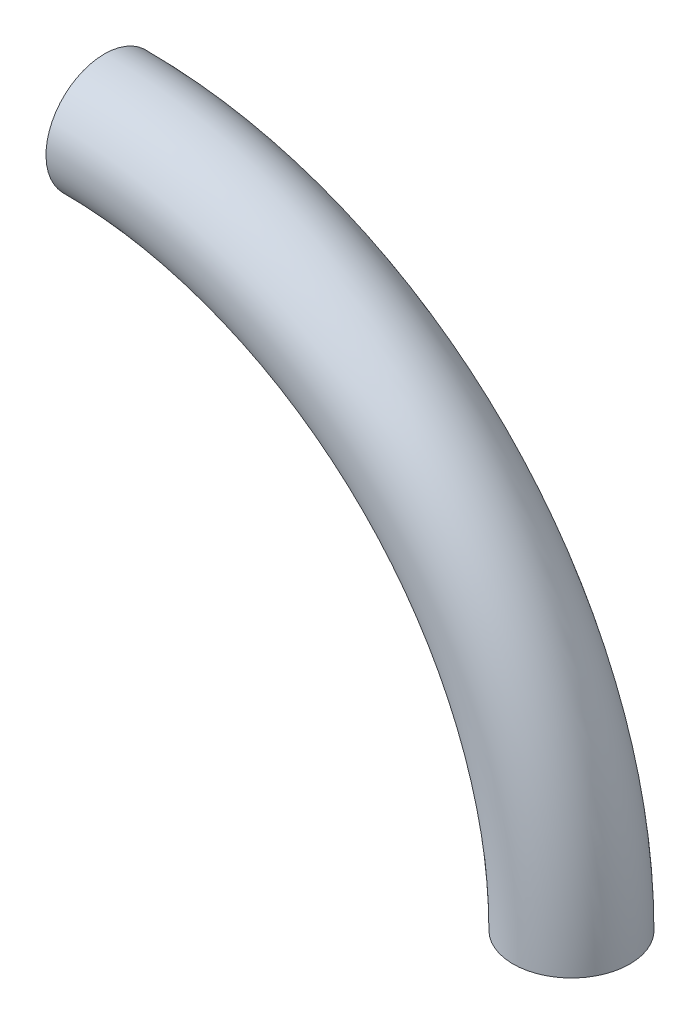
ISO-10303-21;
HEADER;
FILE_DESCRIPTION(('STEP AP214'),'2;1');
FILE_NAME('part.step','',(''),(''),'','','');
FILE_SCHEMA(('AUTOMOTIVE_DESIGN { 1 0 10303 214 1 1 1 1 }'));
ENDSEC;
DATA;
#1=APPLICATION_CONTEXT('core data for automotive mechanical design processes');
#2=APPLICATION_PROTOCOL_DEFINITION('international standard','automotive_design',2000,#1);
#3=PRODUCT_CONTEXT('',#1,'mechanical');
#4=PRODUCT('Part','Part','',(#3));
#5=PRODUCT_RELATED_PRODUCT_CATEGORY('part','',(#4));
#6=PRODUCT_DEFINITION_FORMATION('','',#4);
#7=PRODUCT_DEFINITION_CONTEXT('part definition',#1,'design');
#8=PRODUCT_DEFINITION('design','',#6,#7);
#9=PRODUCT_DEFINITION_SHAPE('','',#8);
#10=(LENGTH_UNIT() NAMED_UNIT(*) SI_UNIT(.MILLI.,.METRE.));
#11=(NAMED_UNIT(*) PLANE_ANGLE_UNIT() SI_UNIT($,.RADIAN.));
#12=(NAMED_UNIT(*) SI_UNIT($,.STERADIAN.) SOLID_ANGLE_UNIT());
#13=UNCERTAINTY_MEASURE_WITH_UNIT(LENGTH_MEASURE(1.E-05),#10,'distance_accuracy_value','');
#14=(GEOMETRIC_REPRESENTATION_CONTEXT(3) GLOBAL_UNCERTAINTY_ASSIGNED_CONTEXT((#13)) GLOBAL_UNIT_ASSIGNED_CONTEXT((#10,
#11,#12)) REPRESENTATION_CONTEXT('',''));
#15=CARTESIAN_POINT('',(0.,0.,0.));
#16=DIRECTION('',(0.,0.,1.));
#17=DIRECTION('',(1.,0.,0.));
#18=AXIS2_PLACEMENT_3D('',#15,#16,#17);
#19=CARTESIAN_POINT('',(0.,-25.4,0.));
#20=DIRECTION('',(0.,0.,-1.));
#21=DIRECTION('',(-1.,0.,0.));
#22=AXIS2_PLACEMENT_3D('',#19,#20,#21);
#23=TOROIDAL_SURFACE('',#22,25.4,2.159);
#24=CARTESIAN_POINT('',(0.,0.,0.));
#25=DIRECTION('',(1.,0.,0.));
#26=DIRECTION('',(0.,1.,0.));
#27=AXIS2_PLACEMENT_3D('',#24,#25,#26);
#28=CIRCLE('',#27,2.159);
#29=CARTESIAN_POINT('',(0.,2.159,0.));
#30=VERTEX_POINT('',#29);
#31=EDGE_CURVE('E38',#30,#30,#28,.T.);
#32=CARTESIAN_POINT('',(25.4,-25.4,0.));
#33=DIRECTION('',(0.,-1.,0.));
#34=DIRECTION('',(1.,0.,0.));
#35=AXIS2_PLACEMENT_3D('',#32,#33,#34);
#36=CIRCLE('',#35,2.159);
#37=CARTESIAN_POINT('',(27.559,-25.4,0.));
#38=VERTEX_POINT('',#37);
#39=EDGE_CURVE('E46',#38,#38,#36,.T.);
#40=CARTESIAN_POINT('',(0.,-25.4,0.));
#41=DIRECTION('',(0.,0.,-1.));
#42=DIRECTION('',(-1.,0.,0.));
#43=AXIS2_PLACEMENT_3D('',#40,#41,#42);
#44=CIRCLE('',#43,27.559);
#45=EDGE_CURVE('',#30,#38,#44,.T.);
#46=ORIENTED_EDGE('',*,*,#31,.F.);
#47=ORIENTED_EDGE('',*,*,#39,.T.);
#48=ORIENTED_EDGE('',*,*,#45,.T.);
#49=ORIENTED_EDGE('',*,*,#45,.F.);
#50=EDGE_LOOP('',(#46,#48,#47,#49));
#51=FACE_BOUND('',#50,.T.);
#52=ADVANCED_FACE('F31',(#51),#23,.F.);
#53=CARTESIAN_POINT('',(0.,-25.4,0.));
#54=DIRECTION('',(0.,0.,-1.));
#55=DIRECTION('',(-1.,0.,0.));
#56=AXIS2_PLACEMENT_3D('',#53,#54,#55);
#57=TOROIDAL_SURFACE('',#56,25.4,3.175);
#58=CARTESIAN_POINT('',(0.,0.,0.));
#59=DIRECTION('',(1.,0.,0.));
#60=DIRECTION('',(0.,1.,0.));
#61=AXIS2_PLACEMENT_3D('',#58,#59,#60);
#62=CIRCLE('',#61,3.175);
#63=CARTESIAN_POINT('',(0.,3.175,0.));
#64=VERTEX_POINT('',#63);
#65=EDGE_CURVE('E10',#64,#64,#62,.T.);
#66=CARTESIAN_POINT('',(25.4,-25.4,0.));
#67=DIRECTION('',(0.,-1.,0.));
#68=DIRECTION('',(1.,0.,0.));
#69=AXIS2_PLACEMENT_3D('',#66,#67,#68);
#70=CIRCLE('',#69,3.175);
#71=CARTESIAN_POINT('',(28.575,-25.4,0.));
#72=VERTEX_POINT('',#71);
#73=EDGE_CURVE('E42',#72,#72,#70,.T.);
#74=CARTESIAN_POINT('',(0.,-25.4,0.));
#75=DIRECTION('',(0.,0.,-1.));
#76=DIRECTION('',(-1.,0.,0.));
#77=AXIS2_PLACEMENT_3D('',#74,#75,#76);
#78=CIRCLE('',#77,28.575);
#79=EDGE_CURVE('',#64,#72,#78,.T.);
#80=ORIENTED_EDGE('',*,*,#65,.T.);
#81=ORIENTED_EDGE('',*,*,#73,.F.);
#82=ORIENTED_EDGE('',*,*,#79,.T.);
#83=ORIENTED_EDGE('',*,*,#79,.F.);
#84=EDGE_LOOP('',(#80,#82,#81,#83));
#85=FACE_BOUND('',#84,.T.);
#86=ADVANCED_FACE('F33',(#85),#57,.T.);
#87=CARTESIAN_POINT('',(0.,0.,0.));
#88=DIRECTION('',(1.,0.,0.));
#89=DIRECTION('',(0.,1.,0.));
#90=AXIS2_PLACEMENT_3D('',#87,#88,#89);
#91=PLANE('',#90);
#92=ORIENTED_EDGE('',*,*,#31,.T.);
#93=EDGE_LOOP('',(#92));
#94=FACE_BOUND('',#93,.T.);
#95=ORIENTED_EDGE('',*,*,#65,.F.);
#96=EDGE_LOOP('',(#95));
#97=FACE_BOUND('',#96,.T.);
#98=ADVANCED_FACE('F56',(#94,#97),#91,.F.);
#99=CARTESIAN_POINT('',(25.4,-25.4,0.));
#100=DIRECTION('',(0.,-1.,0.));
#101=DIRECTION('',(1.,0.,0.));
#102=AXIS2_PLACEMENT_3D('',#99,#100,#101);
#103=PLANE('',#102);
#104=ORIENTED_EDGE('',*,*,#39,.F.);
#105=EDGE_LOOP('',(#104));
#106=FACE_BOUND('',#105,.T.);
#107=ORIENTED_EDGE('',*,*,#73,.T.);
#108=EDGE_LOOP('',(#107));
#109=FACE_BOUND('',#108,.T.);
#110=ADVANCED_FACE('F53',(#106,#109),#103,.T.);
#111=CLOSED_SHELL('',(#52,#86,#98,#110));
#112=MANIFOLD_SOLID_BREP('B2',#111);
#113=ADVANCED_BREP_SHAPE_REPRESENTATION('',(#18,#112),#14);
#114=SHAPE_DEFINITION_REPRESENTATION(#9,#113);
ENDSEC;
END-ISO-10303-21;
